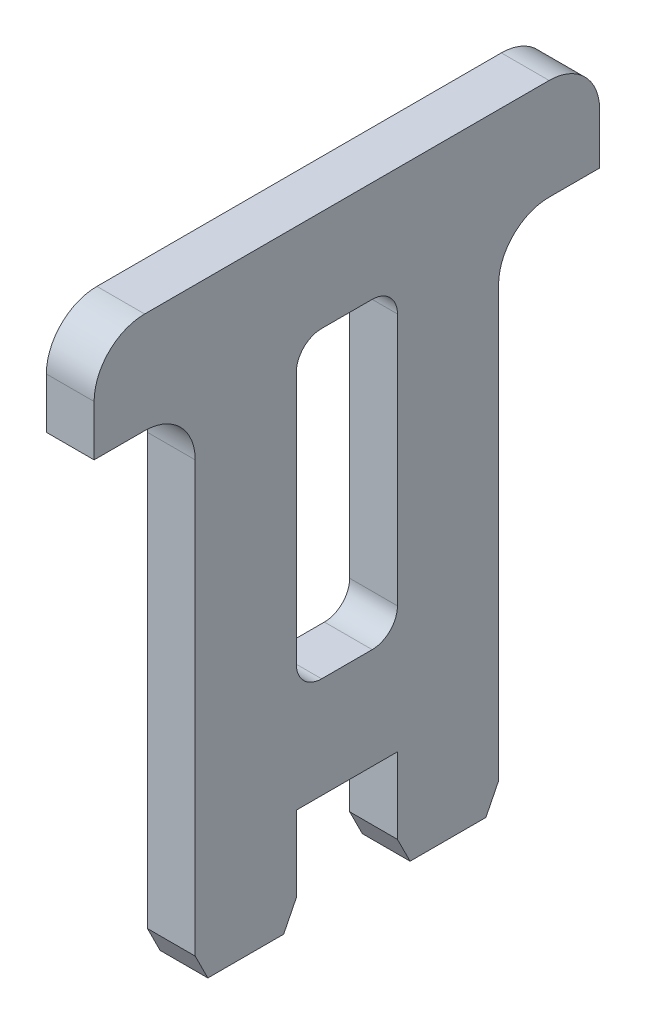
ISO-10303-21;
HEADER;
FILE_DESCRIPTION(('STEP AP214'),'2;1');
FILE_NAME('part.step','',(''),(''),'','','');
FILE_SCHEMA(('AUTOMOTIVE_DESIGN { 1 0 10303 214 1 1 1 1 }'));
ENDSEC;
DATA;
#1=APPLICATION_CONTEXT('core data for automotive mechanical design processes');
#2=APPLICATION_PROTOCOL_DEFINITION('international standard','automotive_design',2000,#1);
#3=PRODUCT_CONTEXT('',#1,'mechanical');
#4=PRODUCT('Part','Part','',(#3));
#5=PRODUCT_RELATED_PRODUCT_CATEGORY('part','',(#4));
#6=PRODUCT_DEFINITION_FORMATION('','',#4);
#7=PRODUCT_DEFINITION_CONTEXT('part definition',#1,'design');
#8=PRODUCT_DEFINITION('design','',#6,#7);
#9=PRODUCT_DEFINITION_SHAPE('','',#8);
#10=(LENGTH_UNIT() NAMED_UNIT(*) SI_UNIT(.MILLI.,.METRE.));
#11=(NAMED_UNIT(*) PLANE_ANGLE_UNIT() SI_UNIT($,.RADIAN.));
#12=(NAMED_UNIT(*) SI_UNIT($,.STERADIAN.) SOLID_ANGLE_UNIT());
#13=UNCERTAINTY_MEASURE_WITH_UNIT(LENGTH_MEASURE(1.E-05),#10,'distance_accuracy_value','');
#14=(GEOMETRIC_REPRESENTATION_CONTEXT(3) GLOBAL_UNCERTAINTY_ASSIGNED_CONTEXT((#13)) GLOBAL_UNIT_ASSIGNED_CONTEXT((#10,
#11,#12)) REPRESENTATION_CONTEXT('',''));
#15=CARTESIAN_POINT('',(0.,0.,0.));
#16=DIRECTION('',(0.,0.,1.));
#17=DIRECTION('',(1.,0.,0.));
#18=AXIS2_PLACEMENT_3D('',#15,#16,#17);
#19=CARTESIAN_POINT('',(2.999999969,25.4,-31.75));
#20=DIRECTION('',(0.,1.,0.));
#21=DIRECTION('',(0.,0.,1.));
#22=AXIS2_PLACEMENT_3D('',#19,#20,#21);
#23=PLANE('',#22);
#24=DIRECTION('',(0.,0.,-1.));
#25=VECTOR('',#24,1.);
#26=CARTESIAN_POINT('',(2.999999969,25.4,-31.75));
#27=LINE('',#26,#25);
#28=CARTESIAN_POINT('',(2.999999969,25.4,-25.4));
#29=VERTEX_POINT('',#28);
#30=CARTESIAN_POINT('',(2.999999969,25.4,-31.75));
#31=VERTEX_POINT('',#30);
#32=EDGE_CURVE('E236',#29,#31,#27,.T.);
#33=ORIENTED_EDGE('',*,*,#32,.F.);
#34=DIRECTION('',(-1.,0.,0.));
#35=VECTOR('',#34,1.);
#36=CARTESIAN_POINT('',(-2.999999969,25.4,-25.4));
#37=LINE('',#36,#35);
#38=CARTESIAN_POINT('',(-2.999999969,25.4,-25.4));
#39=VERTEX_POINT('',#38);
#40=EDGE_CURVE('E298',#29,#39,#37,.T.);
#41=ORIENTED_EDGE('',*,*,#40,.T.);
#42=DIRECTION('',(0.,0.,-1.));
#43=VECTOR('',#42,1.);
#44=CARTESIAN_POINT('',(-2.999999969,25.4,-31.75));
#45=LINE('',#44,#43);
#46=CARTESIAN_POINT('',(-2.999999969,25.4,-31.75));
#47=VERTEX_POINT('',#46);
#48=EDGE_CURVE('E262',#39,#47,#45,.T.);
#49=ORIENTED_EDGE('',*,*,#48,.T.);
#50=DIRECTION('',(-1.,0.,0.));
#51=VECTOR('',#50,1.);
#52=CARTESIAN_POINT('',(2.999999969,25.4,-31.75));
#53=LINE('',#52,#51);
#54=EDGE_CURVE('E255',#31,#47,#53,.T.);
#55=ORIENTED_EDGE('',*,*,#54,.F.);
#56=EDGE_LOOP('',(#33,#41,#49,#55));
#57=FACE_BOUND('',#56,.T.);
#58=ADVANCED_FACE('F50',(#57),#23,.F.);
#59=CARTESIAN_POINT('',(2.999999969,38.1,-31.75));
#60=DIRECTION('',(0.,0.,1.));
#61=DIRECTION('',(0.,-1.,0.));
#62=AXIS2_PLACEMENT_3D('',#59,#60,#61);
#63=PLANE('',#62);
#64=DIRECTION('',(0.,1.,0.));
#65=VECTOR('',#64,1.);
#66=CARTESIAN_POINT('',(-2.999999969,38.1,-31.75));
#67=LINE('',#66,#65);
#68=CARTESIAN_POINT('',(-2.999999969,31.75,-31.75));
#69=VERTEX_POINT('',#68);
#70=EDGE_CURVE('E436',#47,#69,#67,.T.);
#71=ORIENTED_EDGE('',*,*,#70,.T.);
#72=DIRECTION('',(-1.,0.,0.));
#73=VECTOR('',#72,1.);
#74=CARTESIAN_POINT('',(2.999999969,31.75,-31.75));
#75=LINE('',#74,#73);
#76=CARTESIAN_POINT('',(2.999999969,31.75,-31.75));
#77=VERTEX_POINT('',#76);
#78=EDGE_CURVE('E257',#69,#77,#75,.F.);
#79=ORIENTED_EDGE('',*,*,#78,.T.);
#80=DIRECTION('',(0.,1.,0.));
#81=VECTOR('',#80,1.);
#82=CARTESIAN_POINT('',(2.999999969,38.1,-31.75));
#83=LINE('',#82,#81);
#84=EDGE_CURVE('E240',#31,#77,#83,.T.);
#85=ORIENTED_EDGE('',*,*,#84,.F.);
#86=ORIENTED_EDGE('',*,*,#54,.T.);
#87=EDGE_LOOP('',(#71,#79,#85,#86));
#88=FACE_BOUND('',#87,.T.);
#89=ADVANCED_FACE('F254',(#88),#63,.F.);
#90=CARTESIAN_POINT('',(2.999999969,38.1,-31.75));
#91=DIRECTION('',(0.,-1.,0.));
#92=DIRECTION('',(0.,0.,-1.));
#93=AXIS2_PLACEMENT_3D('',#90,#91,#92);
#94=PLANE('',#93);
#95=DIRECTION('',(0.,0.,1.));
#96=VECTOR('',#95,1.);
#97=CARTESIAN_POINT('',(-2.999999969,38.1,-31.75));
#98=LINE('',#97,#96);
#99=CARTESIAN_POINT('',(-2.999999969,38.1,-25.4));
#100=VERTEX_POINT('',#99);
#101=CARTESIAN_POINT('',(-2.999999969,38.1,25.4));
#102=VERTEX_POINT('',#101);
#103=EDGE_CURVE('E438',#100,#102,#98,.T.);
#104=ORIENTED_EDGE('',*,*,#103,.T.);
#105=DIRECTION('',(-1.,0.,0.));
#106=VECTOR('',#105,1.);
#107=CARTESIAN_POINT('',(2.999999969,38.1,25.4));
#108=LINE('',#107,#106);
#109=CARTESIAN_POINT('',(2.999999969,38.1,25.4));
#110=VERTEX_POINT('',#109);
#111=EDGE_CURVE('E287',#102,#110,#108,.F.);
#112=ORIENTED_EDGE('',*,*,#111,.T.);
#113=DIRECTION('',(0.,0.,1.));
#114=VECTOR('',#113,1.);
#115=CARTESIAN_POINT('',(2.999999969,38.1,-31.75));
#116=LINE('',#115,#114);
#117=CARTESIAN_POINT('',(2.999999969,38.1,-25.4));
#118=VERTEX_POINT('',#117);
#119=EDGE_CURVE('E259',#118,#110,#116,.T.);
#120=ORIENTED_EDGE('',*,*,#119,.F.);
#121=DIRECTION('',(-1.,0.,0.));
#122=VECTOR('',#121,1.);
#123=CARTESIAN_POINT('',(2.999999969,38.1,-25.4));
#124=LINE('',#123,#122);
#125=EDGE_CURVE('E283',#118,#100,#124,.T.);
#126=ORIENTED_EDGE('',*,*,#125,.T.);
#127=EDGE_LOOP('',(#104,#112,#120,#126));
#128=FACE_BOUND('',#127,.T.);
#129=ADVANCED_FACE('F650',(#128),#94,.F.);
#130=CARTESIAN_POINT('',(2.999999969,38.1,31.75));
#131=DIRECTION('',(0.,0.,-1.));
#132=DIRECTION('',(-1.,0.,0.));
#133=AXIS2_PLACEMENT_3D('',#130,#131,#132);
#134=PLANE('',#133);
#135=DIRECTION('',(0.,-1.,0.));
#136=VECTOR('',#135,1.);
#137=CARTESIAN_POINT('',(2.999999969,38.1,31.75));
#138=LINE('',#137,#136);
#139=CARTESIAN_POINT('',(2.999999969,31.75,31.75));
#140=VERTEX_POINT('',#139);
#141=CARTESIAN_POINT('',(2.999999969,25.4,31.75));
#142=VERTEX_POINT('',#141);
#143=EDGE_CURVE('E339',#140,#142,#138,.T.);
#144=ORIENTED_EDGE('',*,*,#143,.F.);
#145=DIRECTION('',(-1.,0.,0.));
#146=VECTOR('',#145,1.);
#147=CARTESIAN_POINT('',(2.999999969,31.75,31.75));
#148=LINE('',#147,#146);
#149=CARTESIAN_POINT('',(-2.999999969,31.75,31.75));
#150=VERTEX_POINT('',#149);
#151=EDGE_CURVE('E265',#140,#150,#148,.T.);
#152=ORIENTED_EDGE('',*,*,#151,.T.);
#153=DIRECTION('',(0.,-1.,0.));
#154=VECTOR('',#153,1.);
#155=CARTESIAN_POINT('',(-2.999999969,38.1,31.75));
#156=LINE('',#155,#154);
#157=CARTESIAN_POINT('',(-2.999999969,25.4,31.75));
#158=VERTEX_POINT('',#157);
#159=EDGE_CURVE('E444',#150,#158,#156,.T.);
#160=ORIENTED_EDGE('',*,*,#159,.T.);
#161=DIRECTION('',(-1.,0.,0.));
#162=VECTOR('',#161,1.);
#163=CARTESIAN_POINT('',(2.999999969,25.4,31.75));
#164=LINE('',#163,#162);
#165=EDGE_CURVE('E266',#142,#158,#164,.T.);
#166=ORIENTED_EDGE('',*,*,#165,.F.);
#167=EDGE_LOOP('',(#144,#152,#160,#166));
#168=FACE_BOUND('',#167,.T.);
#169=ADVANCED_FACE('F689',(#168),#134,.F.);
#170=CARTESIAN_POINT('',(2.999999969,25.4,19.05));
#171=DIRECTION('',(0.,1.,0.));
#172=DIRECTION('',(0.,0.,1.));
#173=AXIS2_PLACEMENT_3D('',#170,#171,#172);
#174=PLANE('',#173);
#175=DIRECTION('',(0.,0.,-1.));
#176=VECTOR('',#175,1.);
#177=CARTESIAN_POINT('',(-2.999999969,25.4,19.05));
#178=LINE('',#177,#176);
#179=CARTESIAN_POINT('',(-2.999999969,25.4,25.4));
#180=VERTEX_POINT('',#179);
#181=EDGE_CURVE('E447',#158,#180,#178,.T.);
#182=ORIENTED_EDGE('',*,*,#181,.T.);
#183=DIRECTION('',(-1.,0.,0.));
#184=VECTOR('',#183,1.);
#185=CARTESIAN_POINT('',(2.999999969,25.4,25.4));
#186=LINE('',#185,#184);
#187=CARTESIAN_POINT('',(2.999999969,25.4,25.4));
#188=VERTEX_POINT('',#187);
#189=EDGE_CURVE('E309',#180,#188,#186,.F.);
#190=ORIENTED_EDGE('',*,*,#189,.T.);
#191=DIRECTION('',(0.,0.,-1.));
#192=VECTOR('',#191,1.);
#193=CARTESIAN_POINT('',(2.999999969,25.4,19.05));
#194=LINE('',#193,#192);
#195=EDGE_CURVE('E346',#142,#188,#194,.T.);
#196=ORIENTED_EDGE('',*,*,#195,.F.);
#197=ORIENTED_EDGE('',*,*,#165,.T.);
#198=EDGE_LOOP('',(#182,#190,#196,#197));
#199=FACE_BOUND('',#198,.T.);
#200=ADVANCED_FACE('F684',(#199),#174,.F.);
#201=CARTESIAN_POINT('',(2.999999969,-38.1,19.05));
#202=DIRECTION('',(0.,0.,-1.));
#203=DIRECTION('',(0.,1.,0.));
#204=AXIS2_PLACEMENT_3D('',#201,#202,#203);
#205=PLANE('',#204);
#206=DIRECTION('',(0.,-1.,0.));
#207=VECTOR('',#206,1.);
#208=CARTESIAN_POINT('',(-2.999999969,-38.1,19.05));
#209=LINE('',#208,#207);
#210=CARTESIAN_POINT('',(-2.999999969,19.05,19.05));
#211=VERTEX_POINT('',#210);
#212=CARTESIAN_POINT('',(-2.999999969,-34.925,19.05));
#213=VERTEX_POINT('',#212);
#214=EDGE_CURVE('E451',#211,#213,#209,.T.);
#215=ORIENTED_EDGE('',*,*,#214,.T.);
#216=DIRECTION('',(1.,0.,0.));
#217=VECTOR('',#216,1.);
#218=CARTESIAN_POINT('',(2.999999969,-34.925,19.05));
#219=LINE('',#218,#217);
#220=CARTESIAN_POINT('',(2.999999969,-34.925,19.05));
#221=VERTEX_POINT('',#220);
#222=EDGE_CURVE('E520',#213,#221,#219,.T.);
#223=ORIENTED_EDGE('',*,*,#222,.T.);
#224=DIRECTION('',(0.,-1.,0.));
#225=VECTOR('',#224,1.);
#226=CARTESIAN_POINT('',(2.999999969,-25.4,19.05));
#227=LINE('',#226,#225);
#228=CARTESIAN_POINT('',(2.999999969,19.05,19.05));
#229=VERTEX_POINT('',#228);
#230=EDGE_CURVE('E351',#229,#221,#227,.T.);
#231=ORIENTED_EDGE('',*,*,#230,.F.);
#232=DIRECTION('',(-1.,0.,0.));
#233=VECTOR('',#232,1.);
#234=CARTESIAN_POINT('',(-2.999999969,19.05,19.05));
#235=LINE('',#234,#233);
#236=EDGE_CURVE('E305',#229,#211,#235,.T.);
#237=ORIENTED_EDGE('',*,*,#236,.T.);
#238=EDGE_LOOP('',(#215,#223,#231,#237));
#239=FACE_BOUND('',#238,.T.);
#240=ADVANCED_FACE('F711',(#239),#205,.F.);
#241=CARTESIAN_POINT('',(2.999999969,-38.1,6.35));
#242=DIRECTION('',(0.,1.,0.));
#243=DIRECTION('',(0.,0.,1.));
#244=AXIS2_PLACEMENT_3D('',#241,#242,#243);
#245=PLANE('',#244);
#246=DIRECTION('',(0.,0.,-1.));
#247=VECTOR('',#246,1.);
#248=CARTESIAN_POINT('',(-2.999999969,-38.1,6.35));
#249=LINE('',#248,#247);
#250=CARTESIAN_POINT('',(-2.999999969,-38.1,17.4625));
#251=VERTEX_POINT('',#250);
#252=CARTESIAN_POINT('',(-2.999999969,-38.1,7.93750000000001));
#253=VERTEX_POINT('',#252);
#254=EDGE_CURVE('E455',#251,#253,#249,.T.);
#255=ORIENTED_EDGE('',*,*,#254,.T.);
#256=DIRECTION('',(1.,0.,0.));
#257=VECTOR('',#256,1.);
#258=CARTESIAN_POINT('',(2.999999969,-38.1,7.93750000000001));
#259=LINE('',#258,#257);
#260=CARTESIAN_POINT('',(2.999999969,-38.1,7.93750000000001));
#261=VERTEX_POINT('',#260);
#262=EDGE_CURVE('E12',#253,#261,#259,.T.);
#263=ORIENTED_EDGE('',*,*,#262,.T.);
#264=DIRECTION('',(0.,0.,-1.));
#265=VECTOR('',#264,1.);
#266=CARTESIAN_POINT('',(2.999999969,-38.1,6.35));
#267=LINE('',#266,#265);
#268=CARTESIAN_POINT('',(2.999999969,-38.1,17.4625));
#269=VERTEX_POINT('',#268);
#270=EDGE_CURVE('E356',#269,#261,#267,.T.);
#271=ORIENTED_EDGE('',*,*,#270,.F.);
#272=DIRECTION('',(-1.,0.,0.));
#273=VECTOR('',#272,1.);
#274=CARTESIAN_POINT('',(2.999999969,-38.1,17.4625));
#275=LINE('',#274,#273);
#276=EDGE_CURVE('E516',#269,#251,#275,.T.);
#277=ORIENTED_EDGE('',*,*,#276,.T.);
#278=EDGE_LOOP('',(#255,#263,#271,#277));
#279=FACE_BOUND('',#278,.T.);
#280=ADVANCED_FACE('F546',(#279),#245,.F.);
#281=CARTESIAN_POINT('',(2.999999969,-38.1,6.35));
#282=DIRECTION('',(0.,0.,1.));
#283=DIRECTION('',(0.,-1.,0.));
#284=AXIS2_PLACEMENT_3D('',#281,#282,#283);
#285=PLANE('',#284);
#286=DIRECTION('',(0.,1.,0.));
#287=VECTOR('',#286,1.);
#288=CARTESIAN_POINT('',(2.999999969,-38.1,6.35));
#289=LINE('',#288,#287);
#290=CARTESIAN_POINT('',(2.999999969,-34.925,6.35));
#291=VERTEX_POINT('',#290);
#292=CARTESIAN_POINT('',(2.999999969,-25.4,6.35));
#293=VERTEX_POINT('',#292);
#294=EDGE_CURVE('E362',#291,#293,#289,.T.);
#295=ORIENTED_EDGE('',*,*,#294,.F.);
#296=DIRECTION('',(-1.,0.,0.));
#297=VECTOR('',#296,1.);
#298=CARTESIAN_POINT('',(2.999999969,-34.925,6.35));
#299=LINE('',#298,#297);
#300=CARTESIAN_POINT('',(-2.999999969,-34.925,6.35));
#301=VERTEX_POINT('',#300);
#302=EDGE_CURVE('E60',#291,#301,#299,.T.);
#303=ORIENTED_EDGE('',*,*,#302,.T.);
#304=DIRECTION('',(0.,1.,0.));
#305=VECTOR('',#304,1.);
#306=CARTESIAN_POINT('',(-2.999999969,-38.1,6.35));
#307=LINE('',#306,#305);
#308=CARTESIAN_POINT('',(-2.999999969,-25.4,6.35));
#309=VERTEX_POINT('',#308);
#310=EDGE_CURVE('E458',#301,#309,#307,.T.);
#311=ORIENTED_EDGE('',*,*,#310,.T.);
#312=DIRECTION('',(-1.,0.,0.));
#313=VECTOR('',#312,1.);
#314=CARTESIAN_POINT('',(2.999999969,-25.4,6.35));
#315=LINE('',#314,#313);
#316=EDGE_CURVE('E274',#293,#309,#315,.T.);
#317=ORIENTED_EDGE('',*,*,#316,.F.);
#318=EDGE_LOOP('',(#295,#303,#311,#317));
#319=FACE_BOUND('',#318,.T.);
#320=ADVANCED_FACE('F543',(#319),#285,.F.);
#321=CARTESIAN_POINT('',(2.999999969,-25.4,6.35));
#322=DIRECTION('',(0.,1.,0.));
#323=DIRECTION('',(0.,0.,1.));
#324=AXIS2_PLACEMENT_3D('',#321,#322,#323);
#325=PLANE('',#324);
#326=DIRECTION('',(0.,0.,-1.));
#327=VECTOR('',#326,1.);
#328=CARTESIAN_POINT('',(-2.999999969,-25.4,6.35));
#329=LINE('',#328,#327);
#330=CARTESIAN_POINT('',(-2.999999969,-25.4,-6.35));
#331=VERTEX_POINT('',#330);
#332=EDGE_CURVE('E461',#309,#331,#329,.T.);
#333=ORIENTED_EDGE('',*,*,#332,.T.);
#334=DIRECTION('',(-1.,0.,0.));
#335=VECTOR('',#334,1.);
#336=CARTESIAN_POINT('',(2.999999969,-25.4,-6.35));
#337=LINE('',#336,#335);
#338=CARTESIAN_POINT('',(2.999999969,-25.4,-6.35));
#339=VERTEX_POINT('',#338);
#340=EDGE_CURVE('E474',#339,#331,#337,.T.);
#341=ORIENTED_EDGE('',*,*,#340,.F.);
#342=DIRECTION('',(0.,0.,-1.));
#343=VECTOR('',#342,1.);
#344=CARTESIAN_POINT('',(2.999999969,-25.4,6.35));
#345=LINE('',#344,#343);
#346=EDGE_CURVE('E365',#293,#339,#345,.T.);
#347=ORIENTED_EDGE('',*,*,#346,.F.);
#348=ORIENTED_EDGE('',*,*,#316,.T.);
#349=EDGE_LOOP('',(#333,#341,#347,#348));
#350=FACE_BOUND('',#349,.T.);
#351=ADVANCED_FACE('F483',(#350),#325,.F.);
#352=CARTESIAN_POINT('',(2.999999969,-38.1,-6.35));
#353=DIRECTION('',(0.,0.,-1.));
#354=DIRECTION('',(0.,1.,0.));
#355=AXIS2_PLACEMENT_3D('',#352,#353,#354);
#356=PLANE('',#355);
#357=DIRECTION('',(0.,-1.,0.));
#358=VECTOR('',#357,1.);
#359=CARTESIAN_POINT('',(-2.999999969,-38.1,-6.35));
#360=LINE('',#359,#358);
#361=CARTESIAN_POINT('',(-2.999999969,-34.925,-6.35));
#362=VERTEX_POINT('',#361);
#363=EDGE_CURVE('E464',#331,#362,#360,.T.);
#364=ORIENTED_EDGE('',*,*,#363,.T.);
#365=DIRECTION('',(1.,0.,0.));
#366=VECTOR('',#365,1.);
#367=CARTESIAN_POINT('',(2.999999969,-34.925,-6.35));
#368=LINE('',#367,#366);
#369=CARTESIAN_POINT('',(2.999999969,-34.925,-6.35));
#370=VERTEX_POINT('',#369);
#371=EDGE_CURVE('E497',#362,#370,#368,.T.);
#372=ORIENTED_EDGE('',*,*,#371,.T.);
#373=DIRECTION('',(0.,-1.,0.));
#374=VECTOR('',#373,1.);
#375=CARTESIAN_POINT('',(2.999999969,-38.1,-6.35));
#376=LINE('',#375,#374);
#377=EDGE_CURVE('E368',#339,#370,#376,.T.);
#378=ORIENTED_EDGE('',*,*,#377,.F.);
#379=ORIENTED_EDGE('',*,*,#340,.T.);
#380=EDGE_LOOP('',(#364,#372,#378,#379));
#381=FACE_BOUND('',#380,.T.);
#382=ADVANCED_FACE('F495',(#381),#356,.F.);
#383=CARTESIAN_POINT('',(2.999999969,-38.1,-6.35));
#384=DIRECTION('',(0.,1.,0.));
#385=DIRECTION('',(0.,0.,1.));
#386=AXIS2_PLACEMENT_3D('',#383,#384,#385);
#387=PLANE('',#386);
#388=DIRECTION('',(0.,0.,-1.));
#389=VECTOR('',#388,1.);
#390=CARTESIAN_POINT('',(-2.999999969,-38.1,-6.35));
#391=LINE('',#390,#389);
#392=CARTESIAN_POINT('',(-2.999999969,-38.1,-7.93749999999999));
#393=VERTEX_POINT('',#392);
#394=CARTESIAN_POINT('',(-2.999999969,-38.1,-17.4625));
#395=VERTEX_POINT('',#394);
#396=EDGE_CURVE('E468',#393,#395,#391,.T.);
#397=ORIENTED_EDGE('',*,*,#396,.T.);
#398=DIRECTION('',(1.,0.,0.));
#399=VECTOR('',#398,1.);
#400=CARTESIAN_POINT('',(2.999999969,-38.1,-17.4625));
#401=LINE('',#400,#399);
#402=CARTESIAN_POINT('',(2.999999969,-38.1,-17.4625));
#403=VERTEX_POINT('',#402);
#404=EDGE_CURVE('E533',#395,#403,#401,.T.);
#405=ORIENTED_EDGE('',*,*,#404,.T.);
#406=DIRECTION('',(0.,0.,-1.));
#407=VECTOR('',#406,1.);
#408=CARTESIAN_POINT('',(2.999999969,-38.1,-6.35));
#409=LINE('',#408,#407);
#410=CARTESIAN_POINT('',(2.999999969,-38.1,-7.93749999999999));
#411=VERTEX_POINT('',#410);
#412=EDGE_CURVE('E373',#411,#403,#409,.T.);
#413=ORIENTED_EDGE('',*,*,#412,.F.);
#414=DIRECTION('',(-1.,0.,0.));
#415=VECTOR('',#414,1.);
#416=CARTESIAN_POINT('',(2.999999969,-38.1,-7.93749999999999));
#417=LINE('',#416,#415);
#418=EDGE_CURVE('E554',#411,#393,#417,.T.);
#419=ORIENTED_EDGE('',*,*,#418,.T.);
#420=EDGE_LOOP('',(#397,#405,#413,#419));
#421=FACE_BOUND('',#420,.T.);
#422=ADVANCED_FACE('F706',(#421),#387,.F.);
#423=CARTESIAN_POINT('',(2.999999969,-25.4,-19.05));
#424=DIRECTION('',(0.,0.,1.));
#425=DIRECTION('',(1.,0.,0.));
#426=AXIS2_PLACEMENT_3D('',#423,#424,#425);
#427=PLANE('',#426);
#428=DIRECTION('',(0.,1.,0.));
#429=VECTOR('',#428,1.);
#430=CARTESIAN_POINT('',(2.999999969,-38.1,-19.05));
#431=LINE('',#430,#429);
#432=CARTESIAN_POINT('',(2.999999969,-34.9249999999999,-19.05));
#433=VERTEX_POINT('',#432);
#434=CARTESIAN_POINT('',(2.999999969,19.05,-19.05));
#435=VERTEX_POINT('',#434);
#436=EDGE_CURVE('E376',#433,#435,#431,.T.);
#437=ORIENTED_EDGE('',*,*,#436,.F.);
#438=DIRECTION('',(-1.,0.,0.));
#439=VECTOR('',#438,1.);
#440=CARTESIAN_POINT('',(2.999999969,-34.9249999999999,-19.05));
#441=LINE('',#440,#439);
#442=CARTESIAN_POINT('',(-2.999999969,-34.9249999999999,-19.05));
#443=VERTEX_POINT('',#442);
#444=EDGE_CURVE('E523',#433,#443,#441,.T.);
#445=ORIENTED_EDGE('',*,*,#444,.T.);
#446=DIRECTION('',(0.,1.,0.));
#447=VECTOR('',#446,1.);
#448=CARTESIAN_POINT('',(-2.999999969,-25.4,-19.05));
#449=LINE('',#448,#447);
#450=CARTESIAN_POINT('',(-2.999999969,19.05,-19.05));
#451=VERTEX_POINT('',#450);
#452=EDGE_CURVE('E249',#443,#451,#449,.T.);
#453=ORIENTED_EDGE('',*,*,#452,.T.);
#454=DIRECTION('',(-1.,0.,0.));
#455=VECTOR('',#454,1.);
#456=CARTESIAN_POINT('',(2.999999969,19.05,-19.05));
#457=LINE('',#456,#455);
#458=EDGE_CURVE('E301',#451,#435,#457,.F.);
#459=ORIENTED_EDGE('',*,*,#458,.T.);
#460=EDGE_LOOP('',(#437,#445,#453,#459));
#461=FACE_BOUND('',#460,.T.);
#462=ADVANCED_FACE('F700',(#461),#427,.F.);
#463=CARTESIAN_POINT('',(2.999999969,0.,0.));
#464=DIRECTION('',(-1.,0.,0.));
#465=DIRECTION('',(0.,0.,1.));
#466=AXIS2_PLACEMENT_3D('',#463,#464,#465);
#467=PLANE('',#466);
#468=DIRECTION('',(0.,1.,0.));
#469=VECTOR('',#468,1.);
#470=CARTESIAN_POINT('',(2.999999969,0.,6.35));
#471=LINE('',#470,#469);
#472=CARTESIAN_POINT('',(2.999999969,-9.525,6.35));
#473=VERTEX_POINT('',#472);
#474=CARTESIAN_POINT('',(2.999999969,22.225,6.35));
#475=VERTEX_POINT('',#474);
#476=EDGE_CURVE('E419',#473,#475,#471,.T.);
#477=ORIENTED_EDGE('',*,*,#476,.T.);
#478=CARTESIAN_POINT('',(2.999999969,22.225,3.175));
#479=DIRECTION('',(-1.,0.,0.));
#480=DIRECTION('',(0.,0.,1.));
#481=AXIS2_PLACEMENT_3D('',#478,#479,#480);
#482=CIRCLE('',#481,3.175);
#483=CARTESIAN_POINT('',(2.999999969,25.4,3.175));
#484=VERTEX_POINT('',#483);
#485=EDGE_CURVE('E411',#475,#484,#482,.T.);
#486=ORIENTED_EDGE('',*,*,#485,.T.);
#487=DIRECTION('',(0.,0.,-1.));
#488=VECTOR('',#487,1.);
#489=CARTESIAN_POINT('',(2.999999969,25.4,0.));
#490=LINE('',#489,#488);
#491=CARTESIAN_POINT('',(2.999999969,25.4,-3.175));
#492=VERTEX_POINT('',#491);
#493=EDGE_CURVE('E424',#484,#492,#490,.T.);
#494=ORIENTED_EDGE('',*,*,#493,.T.);
#495=CARTESIAN_POINT('',(2.999999969,22.225,-3.175));
#496=DIRECTION('',(-1.,0.,0.));
#497=DIRECTION('',(0.,0.,1.));
#498=AXIS2_PLACEMENT_3D('',#495,#496,#497);
#499=CIRCLE('',#498,3.175);
#500=CARTESIAN_POINT('',(2.999999969,22.225,-6.35));
#501=VERTEX_POINT('',#500);
#502=EDGE_CURVE('E404',#492,#501,#499,.T.);
#503=ORIENTED_EDGE('',*,*,#502,.T.);
#504=DIRECTION('',(0.,-1.,0.));
#505=VECTOR('',#504,1.);
#506=CARTESIAN_POINT('',(2.999999969,0.,-6.35));
#507=LINE('',#506,#505);
#508=CARTESIAN_POINT('',(2.999999969,-9.525,-6.35));
#509=VERTEX_POINT('',#508);
#510=EDGE_CURVE('E330',#501,#509,#507,.T.);
#511=ORIENTED_EDGE('',*,*,#510,.T.);
#512=CARTESIAN_POINT('',(2.999999969,-9.525,-3.175));
#513=DIRECTION('',(-1.,0.,0.));
#514=DIRECTION('',(0.,0.,1.));
#515=AXIS2_PLACEMENT_3D('',#512,#513,#514);
#516=CIRCLE('',#515,3.175);
#517=CARTESIAN_POINT('',(2.999999969,-12.7,-3.175));
#518=VERTEX_POINT('',#517);
#519=EDGE_CURVE('E393',#509,#518,#516,.T.);
#520=ORIENTED_EDGE('',*,*,#519,.T.);
#521=DIRECTION('',(0.,0.,1.));
#522=VECTOR('',#521,1.);
#523=CARTESIAN_POINT('',(2.999999969,-12.7,0.));
#524=LINE('',#523,#522);
#525=CARTESIAN_POINT('',(2.999999969,-12.7,3.175));
#526=VERTEX_POINT('',#525);
#527=EDGE_CURVE('E423',#518,#526,#524,.T.);
#528=ORIENTED_EDGE('',*,*,#527,.T.);
#529=CARTESIAN_POINT('',(2.999999969,-9.525,3.175));
#530=DIRECTION('',(-1.,0.,0.));
#531=DIRECTION('',(0.,0.,1.));
#532=AXIS2_PLACEMENT_3D('',#529,#530,#531);
#533=CIRCLE('',#532,3.175);
#534=EDGE_CURVE('E383',#526,#473,#533,.T.);
#535=ORIENTED_EDGE('',*,*,#534,.T.);
#536=EDGE_LOOP('',(#477,#486,#494,#503,#511,#520,#528,#535));
#537=FACE_BOUND('',#536,.T.);
#538=ORIENTED_EDGE('',*,*,#412,.T.);
#539=DIRECTION('',(0.,-0.894427190999917,0.447213595499956));
#540=VECTOR('',#539,1.);
#541=CARTESIAN_POINT('',(2.999999969,-34.9249999999999,-19.05));
#542=LINE('',#541,#540);
#543=EDGE_CURVE('E538',#403,#433,#542,.F.);
#544=ORIENTED_EDGE('',*,*,#543,.T.);
#545=ORIENTED_EDGE('',*,*,#436,.T.);
#546=CARTESIAN_POINT('',(2.999999969,19.05,-25.4));
#547=DIRECTION('',(-1.,0.,0.));
#548=DIRECTION('',(0.,0.,1.));
#549=AXIS2_PLACEMENT_3D('',#546,#547,#548);
#550=CIRCLE('',#549,6.35);
#551=EDGE_CURVE('E243',#435,#29,#550,.T.);
#552=ORIENTED_EDGE('',*,*,#551,.T.);
#553=ORIENTED_EDGE('',*,*,#32,.T.);
#554=ORIENTED_EDGE('',*,*,#84,.T.);
#555=CARTESIAN_POINT('',(2.999999969,31.75,-25.4));
#556=DIRECTION('',(-1.,0.,0.));
#557=DIRECTION('',(0.,0.,1.));
#558=AXIS2_PLACEMENT_3D('',#555,#556,#557);
#559=CIRCLE('',#558,6.35);
#560=EDGE_CURVE('E290',#77,#118,#559,.F.);
#561=ORIENTED_EDGE('',*,*,#560,.T.);
#562=ORIENTED_EDGE('',*,*,#119,.T.);
#563=CARTESIAN_POINT('',(2.999999969,31.75,25.4));
#564=DIRECTION('',(-1.,0.,0.));
#565=DIRECTION('',(0.,0.,1.));
#566=AXIS2_PLACEMENT_3D('',#563,#564,#565);
#567=CIRCLE('',#566,6.35);
#568=EDGE_CURVE('E293',#110,#140,#567,.F.);
#569=ORIENTED_EDGE('',*,*,#568,.T.);
#570=ORIENTED_EDGE('',*,*,#143,.T.);
#571=ORIENTED_EDGE('',*,*,#195,.T.);
#572=CARTESIAN_POINT('',(2.999999969,19.05,25.4));
#573=DIRECTION('',(-1.,0.,0.));
#574=DIRECTION('',(0.,0.,1.));
#575=AXIS2_PLACEMENT_3D('',#572,#573,#574);
#576=CIRCLE('',#575,6.35);
#577=EDGE_CURVE('E675',#188,#229,#576,.T.);
#578=ORIENTED_EDGE('',*,*,#577,.T.);
#579=ORIENTED_EDGE('',*,*,#230,.T.);
#580=DIRECTION('',(0.,0.894427190999918,0.447213595499955));
#581=VECTOR('',#580,1.);
#582=CARTESIAN_POINT('',(2.999999969,-38.1,17.4625));
#583=LINE('',#582,#581);
#584=EDGE_CURVE('E505',#221,#269,#583,.F.);
#585=ORIENTED_EDGE('',*,*,#584,.T.);
#586=ORIENTED_EDGE('',*,*,#270,.T.);
#587=DIRECTION('',(0.,-0.894427190999916,0.447213595499958));
#588=VECTOR('',#587,1.);
#589=CARTESIAN_POINT('',(2.999999969,-34.925,6.35));
#590=LINE('',#589,#588);
#591=EDGE_CURVE('E67',#261,#291,#590,.F.);
#592=ORIENTED_EDGE('',*,*,#591,.T.);
#593=ORIENTED_EDGE('',*,*,#294,.T.);
#594=ORIENTED_EDGE('',*,*,#346,.T.);
#595=ORIENTED_EDGE('',*,*,#377,.T.);
#596=DIRECTION('',(0.,0.894427190999917,0.447213595499955));
#597=VECTOR('',#596,1.);
#598=CARTESIAN_POINT('',(2.999999969,-38.1,-7.93749999999999));
#599=LINE('',#598,#597);
#600=EDGE_CURVE('E503',#370,#411,#599,.F.);
#601=ORIENTED_EDGE('',*,*,#600,.T.);
#602=EDGE_LOOP('',(#538,#544,#545,#552,#553,#554,#561,#562,#569,#570,#571,#578,#579,#585,#586,
#592,#593,#594,#595,#601));
#603=FACE_BOUND('',#602,.T.);
#604=ADVANCED_FACE('F239',(#537,#603),#467,.F.);
#605=CARTESIAN_POINT('',(-2.999999969,0.,0.));
#606=DIRECTION('',(-1.,0.,0.));
#607=DIRECTION('',(0.,0.,1.));
#608=AXIS2_PLACEMENT_3D('',#605,#606,#607);
#609=PLANE('',#608);
#610=DIRECTION('',(0.,0.,-1.));
#611=VECTOR('',#610,1.);
#612=CARTESIAN_POINT('',(-2.999999969,-12.7,6.35));
#613=LINE('',#612,#611);
#614=CARTESIAN_POINT('',(-2.999999969,-12.7,3.175));
#615=VERTEX_POINT('',#614);
#616=CARTESIAN_POINT('',(-2.999999969,-12.7,-3.175));
#617=VERTEX_POINT('',#616);
#618=EDGE_CURVE('E580',#615,#617,#613,.T.);
#619=ORIENTED_EDGE('',*,*,#618,.T.);
#620=CARTESIAN_POINT('',(-2.999999969,-9.525,-3.175));
#621=DIRECTION('',(-1.,0.,0.));
#622=DIRECTION('',(0.,0.,1.));
#623=AXIS2_PLACEMENT_3D('',#620,#621,#622);
#624=CIRCLE('',#623,3.175);
#625=CARTESIAN_POINT('',(-2.999999969,-9.525,-6.35));
#626=VERTEX_POINT('',#625);
#627=EDGE_CURVE('E397',#617,#626,#624,.F.);
#628=ORIENTED_EDGE('',*,*,#627,.T.);
#629=DIRECTION('',(0.,1.,0.));
#630=VECTOR('',#629,1.);
#631=CARTESIAN_POINT('',(-2.999999969,-12.7,-6.35));
#632=LINE('',#631,#630);
#633=CARTESIAN_POINT('',(-2.999999969,22.225,-6.35));
#634=VERTEX_POINT('',#633);
#635=EDGE_CURVE('E618',#626,#634,#632,.T.);
#636=ORIENTED_EDGE('',*,*,#635,.T.);
#637=CARTESIAN_POINT('',(-2.999999969,22.225,-3.175));
#638=DIRECTION('',(-1.,0.,0.));
#639=DIRECTION('',(0.,0.,1.));
#640=AXIS2_PLACEMENT_3D('',#637,#638,#639);
#641=CIRCLE('',#640,3.175);
#642=CARTESIAN_POINT('',(-2.999999969,25.4,-3.175));
#643=VERTEX_POINT('',#642);
#644=EDGE_CURVE('E408',#634,#643,#641,.F.);
#645=ORIENTED_EDGE('',*,*,#644,.T.);
#646=DIRECTION('',(0.,0.,1.));
#647=VECTOR('',#646,1.);
#648=CARTESIAN_POINT('',(-2.999999969,25.4,6.35));
#649=LINE('',#648,#647);
#650=CARTESIAN_POINT('',(-2.999999969,25.4,3.175));
#651=VERTEX_POINT('',#650);
#652=EDGE_CURVE('E568',#643,#651,#649,.T.);
#653=ORIENTED_EDGE('',*,*,#652,.T.);
#654=CARTESIAN_POINT('',(-2.999999969,22.225,3.175));
#655=DIRECTION('',(-1.,0.,0.));
#656=DIRECTION('',(0.,0.,1.));
#657=AXIS2_PLACEMENT_3D('',#654,#655,#656);
#658=CIRCLE('',#657,3.175);
#659=CARTESIAN_POINT('',(-2.999999969,22.225,6.35));
#660=VERTEX_POINT('',#659);
#661=EDGE_CURVE('E415',#651,#660,#658,.F.);
#662=ORIENTED_EDGE('',*,*,#661,.T.);
#663=DIRECTION('',(0.,-1.,0.));
#664=VECTOR('',#663,1.);
#665=CARTESIAN_POINT('',(-2.999999969,-12.7,6.35));
#666=LINE('',#665,#664);
#667=CARTESIAN_POINT('',(-2.999999969,-9.525,6.35));
#668=VERTEX_POINT('',#667);
#669=EDGE_CURVE('E565',#660,#668,#666,.T.);
#670=ORIENTED_EDGE('',*,*,#669,.T.);
#671=CARTESIAN_POINT('',(-2.999999969,-9.525,3.175));
#672=DIRECTION('',(-1.,0.,0.));
#673=DIRECTION('',(0.,0.,1.));
#674=AXIS2_PLACEMENT_3D('',#671,#672,#673);
#675=CIRCLE('',#674,3.175);
#676=EDGE_CURVE('E388',#668,#615,#675,.F.);
#677=ORIENTED_EDGE('',*,*,#676,.T.);
#678=EDGE_LOOP('',(#619,#628,#636,#645,#653,#662,#670,#677));
#679=FACE_BOUND('',#678,.T.);
#680=ORIENTED_EDGE('',*,*,#452,.F.);
#681=DIRECTION('',(0.,0.894427190999917,-0.447213595499956));
#682=VECTOR('',#681,1.);
#683=CARTESIAN_POINT('',(-2.999999969,-14.6049999999999,-29.21));
#684=LINE('',#683,#682);
#685=EDGE_CURVE('E530',#443,#395,#684,.F.);
#686=ORIENTED_EDGE('',*,*,#685,.T.);
#687=ORIENTED_EDGE('',*,*,#396,.F.);
#688=DIRECTION('',(0.,-0.894427190999917,-0.447213595499955));
#689=VECTOR('',#688,1.);
#690=CARTESIAN_POINT('',(-2.999999969,-4.44499999999992,8.88999999999991));
#691=LINE('',#690,#689);
#692=EDGE_CURVE('E492',#393,#362,#691,.F.);
#693=ORIENTED_EDGE('',*,*,#692,.T.);
#694=ORIENTED_EDGE('',*,*,#363,.F.);
#695=ORIENTED_EDGE('',*,*,#332,.F.);
#696=ORIENTED_EDGE('',*,*,#310,.F.);
#697=DIRECTION('',(0.,0.894427190999916,-0.447213595499958));
#698=VECTOR('',#697,1.);
#699=CARTESIAN_POINT('',(-2.999999969,-4.44499999999999,-8.88999999999998));
#700=LINE('',#699,#698);
#701=EDGE_CURVE('E527',#301,#253,#700,.F.);
#702=ORIENTED_EDGE('',*,*,#701,.T.);
#703=ORIENTED_EDGE('',*,*,#254,.F.);
#704=DIRECTION('',(0.,-0.894427190999918,-0.447213595499955));
#705=VECTOR('',#704,1.);
#706=CARTESIAN_POINT('',(-2.999999969,-14.6049999999999,29.21));
#707=LINE('',#706,#705);
#708=EDGE_CURVE('E510',#251,#213,#707,.F.);
#709=ORIENTED_EDGE('',*,*,#708,.T.);
#710=ORIENTED_EDGE('',*,*,#214,.F.);
#711=CARTESIAN_POINT('',(-2.999999969,19.05,25.4));
#712=DIRECTION('',(-1.,0.,0.));
#713=DIRECTION('',(0.,0.,1.));
#714=AXIS2_PLACEMENT_3D('',#711,#712,#713);
#715=CIRCLE('',#714,6.35);
#716=EDGE_CURVE('E319',#211,#180,#715,.F.);
#717=ORIENTED_EDGE('',*,*,#716,.T.);
#718=ORIENTED_EDGE('',*,*,#181,.F.);
#719=ORIENTED_EDGE('',*,*,#159,.F.);
#720=CARTESIAN_POINT('',(-2.999999969,31.75,25.4));
#721=DIRECTION('',(-1.,0.,0.));
#722=DIRECTION('',(0.,0.,1.));
#723=AXIS2_PLACEMENT_3D('',#720,#721,#722);
#724=CIRCLE('',#723,6.35);
#725=EDGE_CURVE('E280',#150,#102,#724,.T.);
#726=ORIENTED_EDGE('',*,*,#725,.T.);
#727=ORIENTED_EDGE('',*,*,#103,.F.);
#728=CARTESIAN_POINT('',(-2.999999969,31.75,-25.4));
#729=DIRECTION('',(-1.,0.,0.));
#730=DIRECTION('',(0.,0.,1.));
#731=AXIS2_PLACEMENT_3D('',#728,#729,#730);
#732=CIRCLE('',#731,6.35);
#733=EDGE_CURVE('E271',#100,#69,#732,.T.);
#734=ORIENTED_EDGE('',*,*,#733,.T.);
#735=ORIENTED_EDGE('',*,*,#70,.F.);
#736=ORIENTED_EDGE('',*,*,#48,.F.);
#737=CARTESIAN_POINT('',(-2.999999969,19.05,-25.4));
#738=DIRECTION('',(-1.,0.,0.));
#739=DIRECTION('',(0.,0.,1.));
#740=AXIS2_PLACEMENT_3D('',#737,#738,#739);
#741=CIRCLE('',#740,6.35);
#742=EDGE_CURVE('E312',#39,#451,#741,.F.);
#743=ORIENTED_EDGE('',*,*,#742,.T.);
#744=EDGE_LOOP('',(#680,#686,#687,#693,#694,#695,#696,#702,#703,#709,#710,#717,#718,#719,#726,
#727,#734,#735,#736,#743));
#745=FACE_BOUND('',#744,.T.);
#746=ADVANCED_FACE('F490',(#679,#745),#609,.T.);
#747=CARTESIAN_POINT('',(2.999999969,31.75,25.4));
#748=DIRECTION('',(-1.,0.,0.));
#749=DIRECTION('',(0.,0.,1.));
#750=AXIS2_PLACEMENT_3D('',#747,#748,#749);
#751=CYLINDRICAL_SURFACE('',#750,6.35);
#752=ORIENTED_EDGE('',*,*,#568,.F.);
#753=ORIENTED_EDGE('',*,*,#111,.F.);
#754=ORIENTED_EDGE('',*,*,#725,.F.);
#755=ORIENTED_EDGE('',*,*,#151,.F.);
#756=EDGE_LOOP('',(#752,#753,#754,#755));
#757=FACE_BOUND('',#756,.T.);
#758=ADVANCED_FACE('F654',(#757),#751,.T.);
#759=CARTESIAN_POINT('',(2.999999969,31.75,-25.4));
#760=DIRECTION('',(-1.,0.,0.));
#761=DIRECTION('',(0.,0.,1.));
#762=AXIS2_PLACEMENT_3D('',#759,#760,#761);
#763=CYLINDRICAL_SURFACE('',#762,6.35);
#764=ORIENTED_EDGE('',*,*,#560,.F.);
#765=ORIENTED_EDGE('',*,*,#78,.F.);
#766=ORIENTED_EDGE('',*,*,#733,.F.);
#767=ORIENTED_EDGE('',*,*,#125,.F.);
#768=EDGE_LOOP('',(#764,#765,#766,#767));
#769=FACE_BOUND('',#768,.T.);
#770=ADVANCED_FACE('F657',(#769),#763,.T.);
#771=CARTESIAN_POINT('',(2.999999969,19.05,-25.4));
#772=DIRECTION('',(1.,0.,0.));
#773=DIRECTION('',(0.,0.,-1.));
#774=AXIS2_PLACEMENT_3D('',#771,#772,#773);
#775=CYLINDRICAL_SURFACE('',#774,6.35);
#776=ORIENTED_EDGE('',*,*,#551,.F.);
#777=ORIENTED_EDGE('',*,*,#458,.F.);
#778=ORIENTED_EDGE('',*,*,#742,.F.);
#779=ORIENTED_EDGE('',*,*,#40,.F.);
#780=EDGE_LOOP('',(#776,#777,#778,#779));
#781=FACE_BOUND('',#780,.T.);
#782=ADVANCED_FACE('F661',(#781),#775,.F.);
#783=CARTESIAN_POINT('',(2.999999969,19.05,25.4));
#784=DIRECTION('',(1.,0.,0.));
#785=DIRECTION('',(0.,0.,-1.));
#786=AXIS2_PLACEMENT_3D('',#783,#784,#785);
#787=CYLINDRICAL_SURFACE('',#786,6.35);
#788=ORIENTED_EDGE('',*,*,#577,.F.);
#789=ORIENTED_EDGE('',*,*,#189,.F.);
#790=ORIENTED_EDGE('',*,*,#716,.F.);
#791=ORIENTED_EDGE('',*,*,#236,.F.);
#792=EDGE_LOOP('',(#788,#789,#790,#791));
#793=FACE_BOUND('',#792,.T.);
#794=ADVANCED_FACE('F664',(#793),#787,.F.);
#795=CARTESIAN_POINT('',(-2.999999969,-12.7,-6.35));
#796=DIRECTION('',(0.,0.,-1.));
#797=DIRECTION('',(-1.,0.,0.));
#798=AXIS2_PLACEMENT_3D('',#795,#796,#797);
#799=PLANE('',#798);
#800=ORIENTED_EDGE('',*,*,#635,.F.);
#801=DIRECTION('',(1.,0.,0.));
#802=VECTOR('',#801,1.);
#803=CARTESIAN_POINT('',(2.999999969,-9.525,-6.35));
#804=LINE('',#803,#802);
#805=EDGE_CURVE('E597',#626,#509,#804,.T.);
#806=ORIENTED_EDGE('',*,*,#805,.T.);
#807=ORIENTED_EDGE('',*,*,#510,.F.);
#808=DIRECTION('',(1.,0.,0.));
#809=VECTOR('',#808,1.);
#810=CARTESIAN_POINT('',(-2.999999969,22.225,-6.35));
#811=LINE('',#810,#809);
#812=EDGE_CURVE('E588',#501,#634,#811,.F.);
#813=ORIENTED_EDGE('',*,*,#812,.T.);
#814=EDGE_LOOP('',(#800,#806,#807,#813));
#815=FACE_BOUND('',#814,.T.);
#816=ADVANCED_FACE('F626',(#815),#799,.F.);
#817=CARTESIAN_POINT('',(-2.999999969,-12.7,6.35));
#818=DIRECTION('',(0.,-1.,0.));
#819=DIRECTION('',(0.,0.,-1.));
#820=AXIS2_PLACEMENT_3D('',#817,#818,#819);
#821=PLANE('',#820);
#822=ORIENTED_EDGE('',*,*,#618,.F.);
#823=DIRECTION('',(1.,0.,0.));
#824=VECTOR('',#823,1.);
#825=CARTESIAN_POINT('',(2.999999969,-12.7,3.175));
#826=LINE('',#825,#824);
#827=EDGE_CURVE('E584',#615,#526,#826,.T.);
#828=ORIENTED_EDGE('',*,*,#827,.T.);
#829=ORIENTED_EDGE('',*,*,#527,.F.);
#830=DIRECTION('',(1.,0.,0.));
#831=VECTOR('',#830,1.);
#832=CARTESIAN_POINT('',(-2.999999969,-12.7,-3.175));
#833=LINE('',#832,#831);
#834=EDGE_CURVE('E591',#518,#617,#833,.F.);
#835=ORIENTED_EDGE('',*,*,#834,.T.);
#836=EDGE_LOOP('',(#822,#828,#829,#835));
#837=FACE_BOUND('',#836,.T.);
#838=ADVANCED_FACE('F631',(#837),#821,.F.);
#839=CARTESIAN_POINT('',(-2.999999969,-12.7,6.35));
#840=DIRECTION('',(0.,0.,1.));
#841=DIRECTION('',(1.,0.,0.));
#842=AXIS2_PLACEMENT_3D('',#839,#840,#841);
#843=PLANE('',#842);
#844=ORIENTED_EDGE('',*,*,#476,.F.);
#845=DIRECTION('',(1.,0.,0.));
#846=VECTOR('',#845,1.);
#847=CARTESIAN_POINT('',(-2.999999969,-9.525,6.35));
#848=LINE('',#847,#846);
#849=EDGE_CURVE('E578',#473,#668,#848,.F.);
#850=ORIENTED_EDGE('',*,*,#849,.T.);
#851=ORIENTED_EDGE('',*,*,#669,.F.);
#852=DIRECTION('',(1.,0.,0.));
#853=VECTOR('',#852,1.);
#854=CARTESIAN_POINT('',(2.999999969,22.225,6.35));
#855=LINE('',#854,#853);
#856=EDGE_CURVE('E576',#660,#475,#855,.T.);
#857=ORIENTED_EDGE('',*,*,#856,.T.);
#858=EDGE_LOOP('',(#844,#850,#851,#857));
#859=FACE_BOUND('',#858,.T.);
#860=ADVANCED_FACE('F575',(#859),#843,.F.);
#861=CARTESIAN_POINT('',(-2.999999969,25.4,6.35));
#862=DIRECTION('',(0.,1.,0.));
#863=DIRECTION('',(0.,0.,1.));
#864=AXIS2_PLACEMENT_3D('',#861,#862,#863);
#865=PLANE('',#864);
#866=ORIENTED_EDGE('',*,*,#652,.F.);
#867=DIRECTION('',(1.,0.,0.));
#868=VECTOR('',#867,1.);
#869=CARTESIAN_POINT('',(2.999999969,25.4,-3.175));
#870=LINE('',#869,#868);
#871=EDGE_CURVE('E389',#643,#492,#870,.T.);
#872=ORIENTED_EDGE('',*,*,#871,.T.);
#873=ORIENTED_EDGE('',*,*,#493,.F.);
#874=DIRECTION('',(1.,0.,0.));
#875=VECTOR('',#874,1.);
#876=CARTESIAN_POINT('',(-2.999999969,25.4,3.175));
#877=LINE('',#876,#875);
#878=EDGE_CURVE('E600',#484,#651,#877,.F.);
#879=ORIENTED_EDGE('',*,*,#878,.T.);
#880=EDGE_LOOP('',(#866,#872,#873,#879));
#881=FACE_BOUND('',#880,.T.);
#882=ADVANCED_FACE('F608',(#881),#865,.F.);
#883=CARTESIAN_POINT('',(-2.999999969,-9.525,3.175));
#884=DIRECTION('',(-1.,0.,0.));
#885=DIRECTION('',(0.,0.,1.));
#886=AXIS2_PLACEMENT_3D('',#883,#884,#885);
#887=CYLINDRICAL_SURFACE('',#886,3.175);
#888=ORIENTED_EDGE('',*,*,#676,.F.);
#889=ORIENTED_EDGE('',*,*,#849,.F.);
#890=ORIENTED_EDGE('',*,*,#534,.F.);
#891=ORIENTED_EDGE('',*,*,#827,.F.);
#892=EDGE_LOOP('',(#888,#889,#890,#891));
#893=FACE_BOUND('',#892,.T.);
#894=ADVANCED_FACE('F634',(#893),#887,.F.);
#895=CARTESIAN_POINT('',(-2.999999969,-9.525,-3.175));
#896=DIRECTION('',(-1.,0.,0.));
#897=DIRECTION('',(0.,0.,1.));
#898=AXIS2_PLACEMENT_3D('',#895,#896,#897);
#899=CYLINDRICAL_SURFACE('',#898,3.175);
#900=ORIENTED_EDGE('',*,*,#627,.F.);
#901=ORIENTED_EDGE('',*,*,#834,.F.);
#902=ORIENTED_EDGE('',*,*,#519,.F.);
#903=ORIENTED_EDGE('',*,*,#805,.F.);
#904=EDGE_LOOP('',(#900,#901,#902,#903));
#905=FACE_BOUND('',#904,.T.);
#906=ADVANCED_FACE('F628',(#905),#899,.F.);
#907=CARTESIAN_POINT('',(-2.999999969,22.225,-3.175));
#908=DIRECTION('',(-1.,0.,0.));
#909=DIRECTION('',(0.,0.,1.));
#910=AXIS2_PLACEMENT_3D('',#907,#908,#909);
#911=CYLINDRICAL_SURFACE('',#910,3.175);
#912=ORIENTED_EDGE('',*,*,#644,.F.);
#913=ORIENTED_EDGE('',*,*,#812,.F.);
#914=ORIENTED_EDGE('',*,*,#502,.F.);
#915=ORIENTED_EDGE('',*,*,#871,.F.);
#916=EDGE_LOOP('',(#912,#913,#914,#915));
#917=FACE_BOUND('',#916,.T.);
#918=ADVANCED_FACE('F625',(#917),#911,.F.);
#919=CARTESIAN_POINT('',(-2.999999969,22.225,3.175));
#920=DIRECTION('',(-1.,0.,0.));
#921=DIRECTION('',(0.,0.,1.));
#922=AXIS2_PLACEMENT_3D('',#919,#920,#921);
#923=CYLINDRICAL_SURFACE('',#922,3.175);
#924=ORIENTED_EDGE('',*,*,#661,.F.);
#925=ORIENTED_EDGE('',*,*,#878,.F.);
#926=ORIENTED_EDGE('',*,*,#485,.F.);
#927=ORIENTED_EDGE('',*,*,#856,.F.);
#928=EDGE_LOOP('',(#924,#925,#926,#927));
#929=FACE_BOUND('',#928,.T.);
#930=ADVANCED_FACE('F582',(#929),#923,.F.);
#931=CARTESIAN_POINT('',(2.999999969,-38.1,-7.93749999999999));
#932=DIRECTION('',(0.,0.447213595499955,-0.894427190999917));
#933=DIRECTION('',(-1.,0.,0.));
#934=AXIS2_PLACEMENT_3D('',#931,#932,#933);
#935=PLANE('',#934);
#936=ORIENTED_EDGE('',*,*,#600,.F.);
#937=ORIENTED_EDGE('',*,*,#371,.F.);
#938=ORIENTED_EDGE('',*,*,#692,.F.);
#939=ORIENTED_EDGE('',*,*,#418,.F.);
#940=EDGE_LOOP('',(#936,#937,#938,#939));
#941=FACE_BOUND('',#940,.T.);
#942=ADVANCED_FACE('F500',(#941),#935,.F.);
#943=CARTESIAN_POINT('',(2.999999969,-38.1,17.4625));
#944=DIRECTION('',(0.,0.447213595499955,-0.894427190999918));
#945=DIRECTION('',(-1.,0.,0.));
#946=AXIS2_PLACEMENT_3D('',#943,#944,#945);
#947=PLANE('',#946);
#948=ORIENTED_EDGE('',*,*,#584,.F.);
#949=ORIENTED_EDGE('',*,*,#222,.F.);
#950=ORIENTED_EDGE('',*,*,#708,.F.);
#951=ORIENTED_EDGE('',*,*,#276,.F.);
#952=EDGE_LOOP('',(#948,#949,#950,#951));
#953=FACE_BOUND('',#952,.T.);
#954=ADVANCED_FACE('F550',(#953),#947,.F.);
#955=CARTESIAN_POINT('',(2.999999969,-34.9249999999999,-19.05));
#956=DIRECTION('',(0.,0.447213595499956,0.894427190999917));
#957=DIRECTION('',(-1.,0.,0.));
#958=AXIS2_PLACEMENT_3D('',#955,#956,#957);
#959=PLANE('',#958);
#960=ORIENTED_EDGE('',*,*,#543,.F.);
#961=ORIENTED_EDGE('',*,*,#404,.F.);
#962=ORIENTED_EDGE('',*,*,#685,.F.);
#963=ORIENTED_EDGE('',*,*,#444,.F.);
#964=EDGE_LOOP('',(#960,#961,#962,#963));
#965=FACE_BOUND('',#964,.T.);
#966=ADVANCED_FACE('F704',(#965),#959,.F.);
#967=CARTESIAN_POINT('',(2.999999969,-34.925,6.35));
#968=DIRECTION('',(0.,0.447213595499958,0.894427190999916));
#969=DIRECTION('',(-1.,0.,0.));
#970=AXIS2_PLACEMENT_3D('',#967,#968,#969);
#971=PLANE('',#970);
#972=ORIENTED_EDGE('',*,*,#591,.F.);
#973=ORIENTED_EDGE('',*,*,#262,.F.);
#974=ORIENTED_EDGE('',*,*,#701,.F.);
#975=ORIENTED_EDGE('',*,*,#302,.F.);
#976=EDGE_LOOP('',(#972,#973,#974,#975));
#977=FACE_BOUND('',#976,.T.);
#978=ADVANCED_FACE('F53',(#977),#971,.F.);
#979=CLOSED_SHELL('',(#58,#89,#129,#169,#200,#240,#280,#320,#351,#382,#422,#462,#604,#746,#758,
#770,#782,#794,#816,#838,#860,#882,#894,#906,#918,#930,#942,#954,#966,#978));
#980=MANIFOLD_SOLID_BREP('B2',#979);
#981=ADVANCED_BREP_SHAPE_REPRESENTATION('',(#18,#980),#14);
#982=SHAPE_DEFINITION_REPRESENTATION(#9,#981);
ENDSEC;
END-ISO-10303-21;
